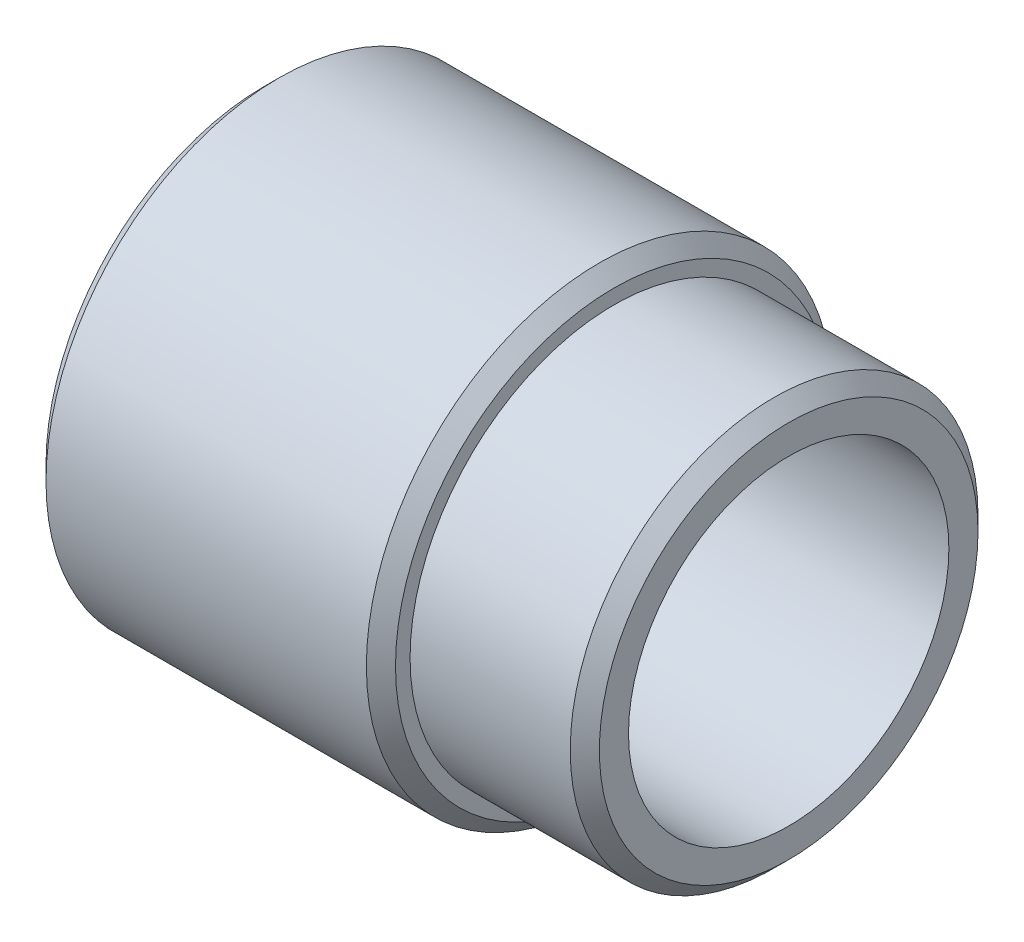
ISO-10303-21;
HEADER;
FILE_DESCRIPTION(('STEP AP214'),'2;1');
FILE_NAME('part.step','',(''),(''),'','','');
FILE_SCHEMA(('AUTOMOTIVE_DESIGN { 1 0 10303 214 1 1 1 1 }'));
ENDSEC;
DATA;
#1=APPLICATION_CONTEXT('core data for automotive mechanical design processes');
#2=APPLICATION_PROTOCOL_DEFINITION('international standard','automotive_design',2000,#1);
#3=PRODUCT_CONTEXT('',#1,'mechanical');
#4=PRODUCT('Part','Part','',(#3));
#5=PRODUCT_RELATED_PRODUCT_CATEGORY('part','',(#4));
#6=PRODUCT_DEFINITION_FORMATION('','',#4);
#7=PRODUCT_DEFINITION_CONTEXT('part definition',#1,'design');
#8=PRODUCT_DEFINITION('design','',#6,#7);
#9=PRODUCT_DEFINITION_SHAPE('','',#8);
#10=(LENGTH_UNIT() NAMED_UNIT(*) SI_UNIT(.MILLI.,.METRE.));
#11=(NAMED_UNIT(*) PLANE_ANGLE_UNIT() SI_UNIT($,.RADIAN.));
#12=(NAMED_UNIT(*) SI_UNIT($,.STERADIAN.) SOLID_ANGLE_UNIT());
#13=UNCERTAINTY_MEASURE_WITH_UNIT(LENGTH_MEASURE(1.E-05),#10,'distance_accuracy_value','');
#14=(GEOMETRIC_REPRESENTATION_CONTEXT(3) GLOBAL_UNCERTAINTY_ASSIGNED_CONTEXT((#13)) GLOBAL_UNIT_ASSIGNED_CONTEXT((#10,
#11,#12)) REPRESENTATION_CONTEXT('',''));
#15=CARTESIAN_POINT('',(0.,0.,0.));
#16=DIRECTION('',(0.,0.,1.));
#17=DIRECTION('',(1.,0.,0.));
#18=AXIS2_PLACEMENT_3D('',#15,#16,#17);
#19=CARTESIAN_POINT('',(0.,0.,0.));
#20=DIRECTION('',(-1.,0.,0.));
#21=DIRECTION('',(0.,0.,1.));
#22=AXIS2_PLACEMENT_3D('',#19,#20,#21);
#23=CYLINDRICAL_SURFACE('',#22,7.);
#24=CARTESIAN_POINT('',(17.5,0.,0.));
#25=DIRECTION('',(1.,0.,0.));
#26=DIRECTION('',(0.,0.,-1.));
#27=AXIS2_PLACEMENT_3D('',#24,#25,#26);
#28=CIRCLE('',#27,7.);
#29=CARTESIAN_POINT('',(17.5,0.,-7.));
#30=VERTEX_POINT('',#29);
#31=EDGE_CURVE('E10',#30,#30,#28,.F.);
#32=ORIENTED_EDGE('',*,*,#31,.T.);
#33=EDGE_LOOP('',(#32));
#34=FACE_BOUND('',#33,.T.);
#35=CARTESIAN_POINT('',(12.,0.,0.));
#36=DIRECTION('',(-1.,0.,0.));
#37=DIRECTION('',(0.,0.,1.));
#38=AXIS2_PLACEMENT_3D('',#35,#36,#37);
#39=CIRCLE('',#38,7.);
#40=CARTESIAN_POINT('',(12.,0.,7.));
#41=VERTEX_POINT('',#40);
#42=EDGE_CURVE('E80',#41,#41,#39,.T.);
#43=ORIENTED_EDGE('',*,*,#42,.F.);
#44=EDGE_LOOP('',(#43));
#45=FACE_BOUND('',#44,.T.);
#46=ADVANCED_FACE('F45',(#34,#45),#23,.T.);
#47=CARTESIAN_POINT('',(0.,0.,0.));
#48=DIRECTION('',(-1.,0.,0.));
#49=DIRECTION('',(0.,0.,1.));
#50=AXIS2_PLACEMENT_3D('',#47,#48,#49);
#51=CYLINDRICAL_SURFACE('',#50,5.5);
#52=CARTESIAN_POINT('',(0.,0.,0.));
#53=DIRECTION('',(-1.,0.,0.));
#54=DIRECTION('',(0.,0.,1.));
#55=AXIS2_PLACEMENT_3D('',#52,#53,#54);
#56=CIRCLE('',#55,5.5);
#57=CARTESIAN_POINT('',(0.,0.,5.5));
#58=VERTEX_POINT('',#57);
#59=EDGE_CURVE('E84',#58,#58,#56,.T.);
#60=ORIENTED_EDGE('',*,*,#59,.T.);
#61=EDGE_LOOP('',(#60));
#62=FACE_BOUND('',#61,.T.);
#63=CARTESIAN_POINT('',(18.,0.,0.));
#64=DIRECTION('',(1.,0.,0.));
#65=DIRECTION('',(0.,0.,-1.));
#66=AXIS2_PLACEMENT_3D('',#63,#64,#65);
#67=CIRCLE('',#66,5.5);
#68=CARTESIAN_POINT('',(18.,0.,-5.5));
#69=VERTEX_POINT('',#68);
#70=EDGE_CURVE('E88',#69,#69,#67,.F.);
#71=ORIENTED_EDGE('',*,*,#70,.F.);
#72=EDGE_LOOP('',(#71));
#73=FACE_BOUND('',#72,.T.);
#74=ADVANCED_FACE('F96',(#62,#73),#51,.F.);
#75=CARTESIAN_POINT('',(0.,7.,0.));
#76=DIRECTION('',(1.,0.,0.));
#77=DIRECTION('',(0.,0.,-1.));
#78=AXIS2_PLACEMENT_3D('',#75,#76,#77);
#79=PLANE('',#78);
#80=CARTESIAN_POINT('',(0.,0.,0.));
#81=DIRECTION('',(1.,0.,0.));
#82=DIRECTION('',(0.,0.,-1.));
#83=AXIS2_PLACEMENT_3D('',#80,#81,#82);
#84=CIRCLE('',#83,7.5);
#85=CARTESIAN_POINT('',(0.,0.,-7.5));
#86=VERTEX_POINT('',#85);
#87=EDGE_CURVE('E60',#86,#86,#84,.F.);
#88=ORIENTED_EDGE('',*,*,#87,.T.);
#89=EDGE_LOOP('',(#88));
#90=FACE_BOUND('',#89,.T.);
#91=ORIENTED_EDGE('',*,*,#59,.F.);
#92=EDGE_LOOP('',(#91));
#93=FACE_BOUND('',#92,.T.);
#94=ADVANCED_FACE('F98',(#90,#93),#79,.F.);
#95=CARTESIAN_POINT('',(18.,9.,0.));
#96=DIRECTION('',(1.,0.,0.));
#97=DIRECTION('',(0.,0.,-1.));
#98=AXIS2_PLACEMENT_3D('',#95,#96,#97);
#99=PLANE('',#98);
#100=CARTESIAN_POINT('',(18.,0.,0.));
#101=DIRECTION('',(1.,0.,0.));
#102=DIRECTION('',(0.,0.,-1.));
#103=AXIS2_PLACEMENT_3D('',#100,#101,#102);
#104=CIRCLE('',#103,6.5);
#105=CARTESIAN_POINT('',(18.,0.,-6.5));
#106=VERTEX_POINT('',#105);
#107=EDGE_CURVE('E54',#106,#106,#104,.T.);
#108=ORIENTED_EDGE('',*,*,#107,.T.);
#109=EDGE_LOOP('',(#108));
#110=FACE_BOUND('',#109,.T.);
#111=ORIENTED_EDGE('',*,*,#70,.T.);
#112=EDGE_LOOP('',(#111));
#113=FACE_BOUND('',#112,.T.);
#114=ADVANCED_FACE('F94',(#110,#113),#99,.T.);
#115=CARTESIAN_POINT('',(12.,0.,0.));
#116=DIRECTION('',(-1.,0.,0.));
#117=DIRECTION('',(0.,0.,1.));
#118=AXIS2_PLACEMENT_3D('',#115,#116,#117);
#119=CYLINDRICAL_SURFACE('',#118,8.);
#120=CARTESIAN_POINT('',(11.5,0.,0.));
#121=DIRECTION('',(-1.,0.,0.));
#122=DIRECTION('',(0.,0.,1.));
#123=AXIS2_PLACEMENT_3D('',#120,#121,#122);
#124=CIRCLE('',#123,8.);
#125=CARTESIAN_POINT('',(11.5,0.,8.));
#126=VERTEX_POINT('',#125);
#127=EDGE_CURVE('E72',#126,#126,#124,.T.);
#128=ORIENTED_EDGE('',*,*,#127,.T.);
#129=EDGE_LOOP('',(#128));
#130=FACE_BOUND('',#129,.T.);
#131=CARTESIAN_POINT('',(0.5,0.,0.));
#132=DIRECTION('',(1.,0.,0.));
#133=DIRECTION('',(0.,0.,-1.));
#134=AXIS2_PLACEMENT_3D('',#131,#132,#133);
#135=CIRCLE('',#134,8.);
#136=CARTESIAN_POINT('',(0.5,0.,-8.));
#137=VERTEX_POINT('',#136);
#138=EDGE_CURVE('E76',#137,#137,#135,.T.);
#139=ORIENTED_EDGE('',*,*,#138,.T.);
#140=EDGE_LOOP('',(#139));
#141=FACE_BOUND('',#140,.T.);
#142=ADVANCED_FACE('F133',(#130,#141),#119,.T.);
#143=CARTESIAN_POINT('',(12.,0.,0.));
#144=DIRECTION('',(-1.,0.,0.));
#145=DIRECTION('',(0.,0.,1.));
#146=AXIS2_PLACEMENT_3D('',#143,#144,#145);
#147=PLANE('',#146);
#148=CARTESIAN_POINT('',(12.,0.,0.));
#149=DIRECTION('',(-1.,0.,0.));
#150=DIRECTION('',(0.,0.,1.));
#151=AXIS2_PLACEMENT_3D('',#148,#149,#150);
#152=CIRCLE('',#151,7.5);
#153=CARTESIAN_POINT('',(12.,0.,7.5));
#154=VERTEX_POINT('',#153);
#155=EDGE_CURVE('E66',#154,#154,#152,.F.);
#156=ORIENTED_EDGE('',*,*,#155,.T.);
#157=EDGE_LOOP('',(#156));
#158=FACE_BOUND('',#157,.T.);
#159=ORIENTED_EDGE('',*,*,#42,.T.);
#160=EDGE_LOOP('',(#159));
#161=FACE_BOUND('',#160,.T.);
#162=ADVANCED_FACE('F117',(#158,#161),#147,.F.);
#163=CARTESIAN_POINT('',(11.5,0.,0.));
#164=DIRECTION('',(-1.,0.,0.));
#165=DIRECTION('',(0.,0.,1.));
#166=AXIS2_PLACEMENT_3D('',#163,#164,#165);
#167=CONICAL_SURFACE('',#166,8.,0.785398163397447);
#168=ORIENTED_EDGE('',*,*,#155,.F.);
#169=EDGE_LOOP('',(#168));
#170=FACE_BOUND('',#169,.T.);
#171=ORIENTED_EDGE('',*,*,#127,.F.);
#172=EDGE_LOOP('',(#171));
#173=FACE_BOUND('',#172,.T.);
#174=ADVANCED_FACE('F111',(#170,#173),#167,.T.);
#175=CARTESIAN_POINT('',(0.,0.,0.));
#176=DIRECTION('',(1.,0.,0.));
#177=DIRECTION('',(0.,0.,-1.));
#178=AXIS2_PLACEMENT_3D('',#175,#176,#177);
#179=CONICAL_SURFACE('',#178,7.5,0.785398163397445);
#180=ORIENTED_EDGE('',*,*,#138,.F.);
#181=EDGE_LOOP('',(#180));
#182=FACE_BOUND('',#181,.T.);
#183=ORIENTED_EDGE('',*,*,#87,.F.);
#184=EDGE_LOOP('',(#183));
#185=FACE_BOUND('',#184,.T.);
#186=ADVANCED_FACE('F116',(#182,#185),#179,.T.);
#187=CARTESIAN_POINT('',(18.,0.,0.));
#188=DIRECTION('',(-1.,0.,0.));
#189=DIRECTION('',(0.,0.,1.));
#190=AXIS2_PLACEMENT_3D('',#187,#188,#189);
#191=CONICAL_SURFACE('',#190,6.5,0.785398163397445);
#192=ORIENTED_EDGE('',*,*,#31,.F.);
#193=EDGE_LOOP('',(#192));
#194=FACE_BOUND('',#193,.T.);
#195=ORIENTED_EDGE('',*,*,#107,.F.);
#196=EDGE_LOOP('',(#195));
#197=FACE_BOUND('',#196,.T.);
#198=ADVANCED_FACE('F48',(#194,#197),#191,.T.);
#199=CLOSED_SHELL('',(#46,#74,#94,#114,#142,#162,#174,#186,#198));
#200=MANIFOLD_SOLID_BREP('B2',#199);
#201=ADVANCED_BREP_SHAPE_REPRESENTATION('',(#18,#200),#14);
#202=SHAPE_DEFINITION_REPRESENTATION(#9,#201);
ENDSEC;
END-ISO-10303-21;
